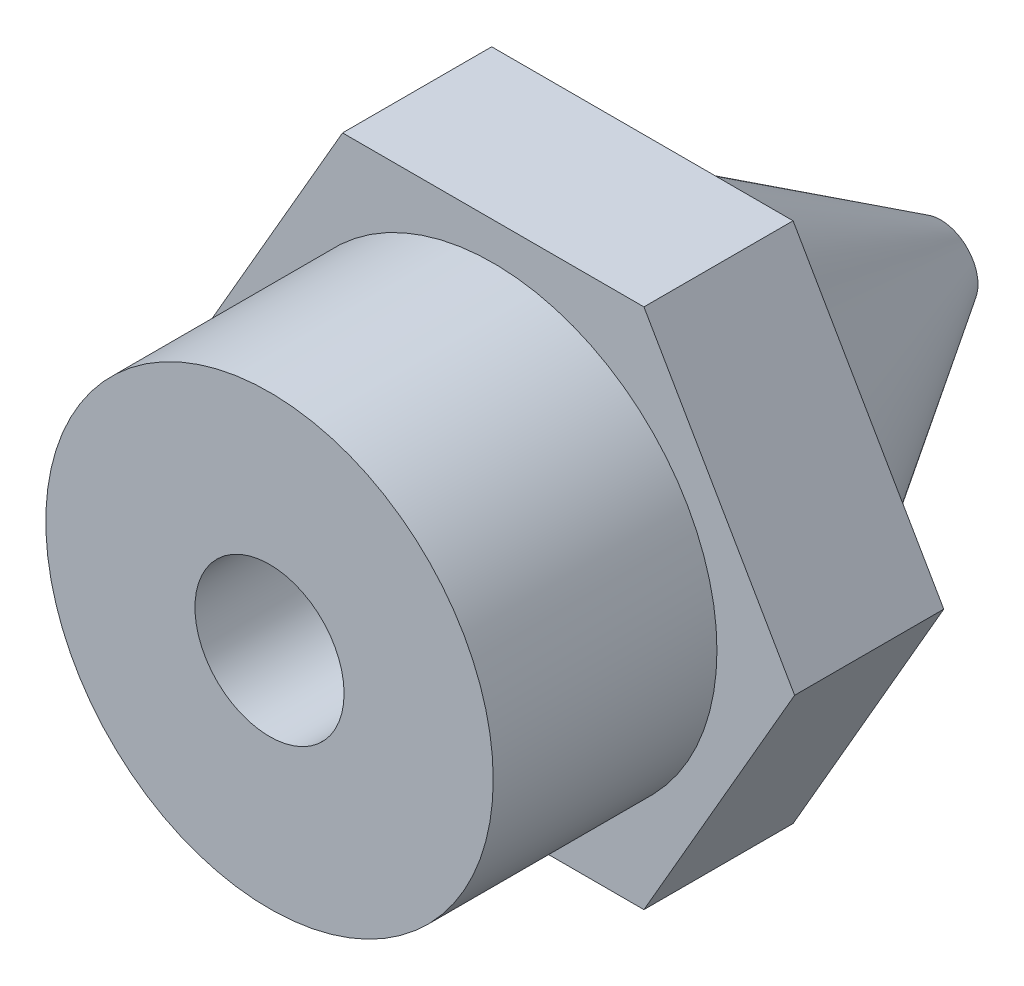
ISO-10303-21;
HEADER;
FILE_DESCRIPTION(('STEP AP214'),'2;1');
FILE_NAME('part.step','',(''),(''),'','','');
FILE_SCHEMA(('AUTOMOTIVE_DESIGN { 1 0 10303 214 1 1 1 1 }'));
ENDSEC;
DATA;
#1=APPLICATION_CONTEXT('core data for automotive mechanical design processes');
#2=APPLICATION_PROTOCOL_DEFINITION('international standard','automotive_design',2000,#1);
#3=PRODUCT_CONTEXT('',#1,'mechanical');
#4=PRODUCT('Part','Part','',(#3));
#5=PRODUCT_RELATED_PRODUCT_CATEGORY('part','',(#4));
#6=PRODUCT_DEFINITION_FORMATION('','',#4);
#7=PRODUCT_DEFINITION_CONTEXT('part definition',#1,'design');
#8=PRODUCT_DEFINITION('design','',#6,#7);
#9=PRODUCT_DEFINITION_SHAPE('','',#8);
#10=(LENGTH_UNIT() NAMED_UNIT(*) SI_UNIT(.MILLI.,.METRE.));
#11=(NAMED_UNIT(*) PLANE_ANGLE_UNIT() SI_UNIT($,.RADIAN.));
#12=(NAMED_UNIT(*) SI_UNIT($,.STERADIAN.) SOLID_ANGLE_UNIT());
#13=UNCERTAINTY_MEASURE_WITH_UNIT(LENGTH_MEASURE(1.E-05),#10,'distance_accuracy_value','');
#14=(GEOMETRIC_REPRESENTATION_CONTEXT(3) GLOBAL_UNCERTAINTY_ASSIGNED_CONTEXT((#13)) GLOBAL_UNIT_ASSIGNED_CONTEXT((#10,
#11,#12)) REPRESENTATION_CONTEXT('',''));
#15=CARTESIAN_POINT('',(0.,0.,0.));
#16=DIRECTION('',(0.,0.,1.));
#17=DIRECTION('',(1.,0.,0.));
#18=AXIS2_PLACEMENT_3D('',#15,#16,#17);
#19=CARTESIAN_POINT('',(2.02072594216368,3.50000000000001,9.));
#20=DIRECTION('',(0.,-1.,0.));
#21=DIRECTION('',(1.,0.,0.));
#22=AXIS2_PLACEMENT_3D('',#19,#20,#21);
#23=PLANE('',#22);
#24=DIRECTION('',(1.,0.,0.));
#25=VECTOR('',#24,1.);
#26=CARTESIAN_POINT('',(2.02072594216368,3.50000000000001,4.));
#27=LINE('',#26,#25);
#28=CARTESIAN_POINT('',(-2.02072594216371,3.49999999999999,4.));
#29=VERTEX_POINT('',#28);
#30=CARTESIAN_POINT('',(2.02072594216368,3.50000000000001,4.));
#31=VERTEX_POINT('',#30);
#32=EDGE_CURVE('E51',#29,#31,#27,.T.);
#33=ORIENTED_EDGE('',*,*,#32,.F.);
#34=DIRECTION('',(0.,0.,-1.));
#35=VECTOR('',#34,1.);
#36=CARTESIAN_POINT('',(-2.02072594216371,3.49999999999999,9.));
#37=LINE('',#36,#35);
#38=CARTESIAN_POINT('',(-2.02072594216371,3.49999999999999,6.));
#39=VERTEX_POINT('',#38);
#40=EDGE_CURVE('E119',#39,#29,#37,.T.);
#41=ORIENTED_EDGE('',*,*,#40,.F.);
#42=DIRECTION('',(-1.,0.,0.));
#43=VECTOR('',#42,1.);
#44=CARTESIAN_POINT('',(2.02072594216368,3.50000000000001,6.));
#45=LINE('',#44,#43);
#46=CARTESIAN_POINT('',(2.02072594216368,3.50000000000001,6.));
#47=VERTEX_POINT('',#46);
#48=EDGE_CURVE('E110',#47,#39,#45,.T.);
#49=ORIENTED_EDGE('',*,*,#48,.F.);
#50=DIRECTION('',(0.,0.,-1.));
#51=VECTOR('',#50,1.);
#52=CARTESIAN_POINT('',(2.02072594216368,3.50000000000001,9.));
#53=LINE('',#52,#51);
#54=EDGE_CURVE('E106',#47,#31,#53,.T.);
#55=ORIENTED_EDGE('',*,*,#54,.T.);
#56=EDGE_LOOP('',(#33,#41,#49,#55));
#57=FACE_BOUND('',#56,.T.);
#58=ADVANCED_FACE('F36',(#57),#23,.F.);
#59=CARTESIAN_POINT('',(-2.02072594216371,3.49999999999999,9.));
#60=DIRECTION('',(0.866025403784441,-0.499999999999995,0.));
#61=DIRECTION('',(0.499999999999995,0.866025403784442,0.));
#62=AXIS2_PLACEMENT_3D('',#59,#60,#61);
#63=PLANE('',#62);
#64=DIRECTION('',(0.499999999999995,0.866025403784442,0.));
#65=VECTOR('',#64,1.);
#66=CARTESIAN_POINT('',(-2.02072594216371,3.49999999999999,4.));
#67=LINE('',#66,#65);
#68=CARTESIAN_POINT('',(-4.04145188432738,0.,4.));
#69=VERTEX_POINT('',#68);
#70=EDGE_CURVE('E142',#69,#29,#67,.T.);
#71=ORIENTED_EDGE('',*,*,#70,.F.);
#72=DIRECTION('',(0.,0.,-1.));
#73=VECTOR('',#72,1.);
#74=CARTESIAN_POINT('',(-4.04145188432738,0.,9.));
#75=LINE('',#74,#73);
#76=CARTESIAN_POINT('',(-4.04145188432738,0.,6.));
#77=VERTEX_POINT('',#76);
#78=EDGE_CURVE('E116',#77,#69,#75,.T.);
#79=ORIENTED_EDGE('',*,*,#78,.F.);
#80=DIRECTION('',(-0.499999999999995,-0.866025403784442,0.));
#81=VECTOR('',#80,1.);
#82=CARTESIAN_POINT('',(-2.02072594216371,3.49999999999999,6.));
#83=LINE('',#82,#81);
#84=EDGE_CURVE('E127',#39,#77,#83,.T.);
#85=ORIENTED_EDGE('',*,*,#84,.F.);
#86=ORIENTED_EDGE('',*,*,#40,.T.);
#87=EDGE_LOOP('',(#71,#79,#85,#86));
#88=FACE_BOUND('',#87,.T.);
#89=ADVANCED_FACE('F179',(#88),#63,.F.);
#90=CARTESIAN_POINT('',(-4.04145188432738,0.,9.));
#91=DIRECTION('',(0.866025403784434,0.500000000000007,0.));
#92=DIRECTION('',(-0.500000000000007,0.866025403784435,0.));
#93=AXIS2_PLACEMENT_3D('',#90,#91,#92);
#94=PLANE('',#93);
#95=DIRECTION('',(-0.500000000000007,0.866025403784435,0.));
#96=VECTOR('',#95,1.);
#97=CARTESIAN_POINT('',(-4.04145188432738,0.,4.));
#98=LINE('',#97,#96);
#99=CARTESIAN_POINT('',(-2.02072594216366,-3.50000000000002,4.));
#100=VERTEX_POINT('',#99);
#101=EDGE_CURVE('E144',#100,#69,#98,.T.);
#102=ORIENTED_EDGE('',*,*,#101,.F.);
#103=DIRECTION('',(0.,0.,-1.));
#104=VECTOR('',#103,1.);
#105=CARTESIAN_POINT('',(-2.02072594216366,-3.50000000000002,9.));
#106=LINE('',#105,#104);
#107=CARTESIAN_POINT('',(-2.02072594216366,-3.50000000000002,6.));
#108=VERTEX_POINT('',#107);
#109=EDGE_CURVE('E108',#108,#100,#106,.T.);
#110=ORIENTED_EDGE('',*,*,#109,.F.);
#111=DIRECTION('',(0.500000000000007,-0.866025403784435,0.));
#112=VECTOR('',#111,1.);
#113=CARTESIAN_POINT('',(-4.04145188432738,0.,6.));
#114=LINE('',#113,#112);
#115=EDGE_CURVE('E128',#77,#108,#114,.T.);
#116=ORIENTED_EDGE('',*,*,#115,.F.);
#117=ORIENTED_EDGE('',*,*,#78,.T.);
#118=EDGE_LOOP('',(#102,#110,#116,#117));
#119=FACE_BOUND('',#118,.T.);
#120=ADVANCED_FACE('F183',(#119),#94,.F.);
#121=CARTESIAN_POINT('',(-2.02072594216366,-3.50000000000002,9.));
#122=DIRECTION('',(0.,1.,0.));
#123=DIRECTION('',(-1.,0.,0.));
#124=AXIS2_PLACEMENT_3D('',#121,#122,#123);
#125=PLANE('',#124);
#126=DIRECTION('',(-1.,0.,0.));
#127=VECTOR('',#126,1.);
#128=CARTESIAN_POINT('',(-2.02072594216366,-3.50000000000002,4.));
#129=LINE('',#128,#127);
#130=CARTESIAN_POINT('',(2.02072594216373,-3.49999999999998,4.));
#131=VERTEX_POINT('',#130);
#132=EDGE_CURVE('E102',#131,#100,#129,.T.);
#133=ORIENTED_EDGE('',*,*,#132,.F.);
#134=DIRECTION('',(0.,0.,-1.));
#135=VECTOR('',#134,1.);
#136=CARTESIAN_POINT('',(2.02072594216373,-3.49999999999998,9.));
#137=LINE('',#136,#135);
#138=CARTESIAN_POINT('',(2.02072594216373,-3.49999999999998,6.));
#139=VERTEX_POINT('',#138);
#140=EDGE_CURVE('E101',#139,#131,#137,.T.);
#141=ORIENTED_EDGE('',*,*,#140,.F.);
#142=DIRECTION('',(1.,0.,0.));
#143=VECTOR('',#142,1.);
#144=CARTESIAN_POINT('',(-2.02072594216366,-3.50000000000002,6.));
#145=LINE('',#144,#143);
#146=EDGE_CURVE('E132',#108,#139,#145,.T.);
#147=ORIENTED_EDGE('',*,*,#146,.F.);
#148=ORIENTED_EDGE('',*,*,#109,.T.);
#149=EDGE_LOOP('',(#133,#141,#147,#148));
#150=FACE_BOUND('',#149,.T.);
#151=ADVANCED_FACE('F189',(#150),#125,.F.);
#152=CARTESIAN_POINT('',(2.02072594216373,-3.49999999999998,9.));
#153=DIRECTION('',(-0.866025403784442,0.499999999999995,0.));
#154=DIRECTION('',(-0.499999999999995,-0.866025403784442,0.));
#155=AXIS2_PLACEMENT_3D('',#152,#153,#154);
#156=PLANE('',#155);
#157=DIRECTION('',(-0.499999999999995,-0.866025403784442,0.));
#158=VECTOR('',#157,1.);
#159=CARTESIAN_POINT('',(2.02072594216373,-3.49999999999998,4.));
#160=LINE('',#159,#158);
#161=CARTESIAN_POINT('',(4.04145188432738,0.,4.));
#162=VERTEX_POINT('',#161);
#163=EDGE_CURVE('E88',#162,#131,#160,.T.);
#164=ORIENTED_EDGE('',*,*,#163,.F.);
#165=DIRECTION('',(0.,0.,-1.));
#166=VECTOR('',#165,1.);
#167=CARTESIAN_POINT('',(4.04145188432738,0.,9.));
#168=LINE('',#167,#166);
#169=CARTESIAN_POINT('',(4.04145188432738,0.,6.));
#170=VERTEX_POINT('',#169);
#171=EDGE_CURVE('E99',#170,#162,#168,.T.);
#172=ORIENTED_EDGE('',*,*,#171,.F.);
#173=DIRECTION('',(0.499999999999995,0.866025403784442,0.));
#174=VECTOR('',#173,1.);
#175=CARTESIAN_POINT('',(2.02072594216373,-3.49999999999998,6.));
#176=LINE('',#175,#174);
#177=EDGE_CURVE('E59',#139,#170,#176,.T.);
#178=ORIENTED_EDGE('',*,*,#177,.F.);
#179=ORIENTED_EDGE('',*,*,#140,.T.);
#180=EDGE_LOOP('',(#164,#172,#178,#179));
#181=FACE_BOUND('',#180,.T.);
#182=ADVANCED_FACE('F98',(#181),#156,.F.);
#183=CARTESIAN_POINT('',(4.04145188432738,0.,9.));
#184=DIRECTION('',(-0.866025403784438,-0.500000000000001,0.));
#185=DIRECTION('',(0.500000000000001,-0.866025403784438,0.));
#186=AXIS2_PLACEMENT_3D('',#183,#184,#185);
#187=PLANE('',#186);
#188=DIRECTION('',(0.500000000000001,-0.866025403784438,0.));
#189=VECTOR('',#188,1.);
#190=CARTESIAN_POINT('',(4.04145188432738,0.,4.));
#191=LINE('',#190,#189);
#192=EDGE_CURVE('E44',#31,#162,#191,.T.);
#193=ORIENTED_EDGE('',*,*,#192,.F.);
#194=ORIENTED_EDGE('',*,*,#54,.F.);
#195=DIRECTION('',(-0.500000000000001,0.866025403784438,0.));
#196=VECTOR('',#195,1.);
#197=CARTESIAN_POINT('',(4.04145188432738,0.,6.));
#198=LINE('',#197,#196);
#199=EDGE_CURVE('E94',#170,#47,#198,.T.);
#200=ORIENTED_EDGE('',*,*,#199,.F.);
#201=ORIENTED_EDGE('',*,*,#171,.T.);
#202=EDGE_LOOP('',(#193,#194,#200,#201));
#203=FACE_BOUND('',#202,.T.);
#204=ADVANCED_FACE('F105',(#203),#187,.F.);
#205=CARTESIAN_POINT('',(0.,0.,6.));
#206=DIRECTION('',(0.,0.,1.));
#207=DIRECTION('',(1.,0.,0.));
#208=AXIS2_PLACEMENT_3D('',#205,#206,#207);
#209=PLANE('',#208);
#210=CARTESIAN_POINT('',(0.,0.,6.));
#211=DIRECTION('',(0.,0.,1.));
#212=DIRECTION('',(1.,0.,0.));
#213=AXIS2_PLACEMENT_3D('',#210,#211,#212);
#214=CIRCLE('',#213,3.);
#215=CARTESIAN_POINT('',(3.,0.,6.));
#216=VERTEX_POINT('',#215);
#217=EDGE_CURVE('E135',#216,#216,#214,.T.);
#218=ORIENTED_EDGE('',*,*,#217,.F.);
#219=EDGE_LOOP('',(#218));
#220=FACE_BOUND('',#219,.T.);
#221=ORIENTED_EDGE('',*,*,#48,.T.);
#222=ORIENTED_EDGE('',*,*,#84,.T.);
#223=ORIENTED_EDGE('',*,*,#115,.T.);
#224=ORIENTED_EDGE('',*,*,#146,.T.);
#225=ORIENTED_EDGE('',*,*,#177,.T.);
#226=ORIENTED_EDGE('',*,*,#199,.T.);
#227=EDGE_LOOP('',(#221,#222,#223,#224,#225,#226));
#228=FACE_BOUND('',#227,.T.);
#229=ADVANCED_FACE('F123',(#220,#228),#209,.T.);
#230=CARTESIAN_POINT('',(0.,0.,6.));
#231=DIRECTION('',(0.,0.,1.));
#232=DIRECTION('',(1.,0.,0.));
#233=AXIS2_PLACEMENT_3D('',#230,#231,#232);
#234=CYLINDRICAL_SURFACE('',#233,3.);
#235=ORIENTED_EDGE('',*,*,#217,.T.);
#236=EDGE_LOOP('',(#235));
#237=FACE_BOUND('',#236,.T.);
#238=CARTESIAN_POINT('',(0.,0.,9.));
#239=DIRECTION('',(0.,0.,1.));
#240=DIRECTION('',(1.,0.,0.));
#241=AXIS2_PLACEMENT_3D('',#238,#239,#240);
#242=CIRCLE('',#241,3.);
#243=CARTESIAN_POINT('',(3.,0.,9.));
#244=VERTEX_POINT('',#243);
#245=EDGE_CURVE('E136',#244,#244,#242,.T.);
#246=ORIENTED_EDGE('',*,*,#245,.F.);
#247=EDGE_LOOP('',(#246));
#248=FACE_BOUND('',#247,.T.);
#249=ADVANCED_FACE('F164',(#237,#248),#234,.T.);
#250=CARTESIAN_POINT('',(0.,0.,9.));
#251=DIRECTION('',(0.,0.,1.));
#252=DIRECTION('',(1.,0.,0.));
#253=AXIS2_PLACEMENT_3D('',#250,#251,#252);
#254=PLANE('',#253);
#255=CARTESIAN_POINT('',(0.,0.,9.));
#256=DIRECTION('',(0.,0.,1.));
#257=DIRECTION('',(1.,0.,0.));
#258=AXIS2_PLACEMENT_3D('',#255,#256,#257);
#259=CIRCLE('',#258,1.);
#260=CARTESIAN_POINT('',(1.,0.,9.));
#261=VERTEX_POINT('',#260);
#262=EDGE_CURVE('E155',#261,#261,#259,.T.);
#263=ORIENTED_EDGE('',*,*,#262,.F.);
#264=EDGE_LOOP('',(#263));
#265=FACE_BOUND('',#264,.T.);
#266=ORIENTED_EDGE('',*,*,#245,.T.);
#267=EDGE_LOOP('',(#266));
#268=FACE_BOUND('',#267,.T.);
#269=ADVANCED_FACE('F161',(#265,#268),#254,.T.);
#270=CARTESIAN_POINT('',(0.,0.,4.));
#271=DIRECTION('',(0.,0.,-1.));
#272=DIRECTION('',(-1.,0.,0.));
#273=AXIS2_PLACEMENT_3D('',#270,#271,#272);
#274=PLANE('',#273);
#275=CARTESIAN_POINT('',(0.,0.,4.));
#276=DIRECTION('',(0.,0.,-1.));
#277=DIRECTION('',(-1.,0.,0.));
#278=AXIS2_PLACEMENT_3D('',#275,#276,#277);
#279=CIRCLE('',#278,3.);
#280=CARTESIAN_POINT('',(2.99999999999998,0.,4.));
#281=VERTEX_POINT('',#280);
#282=EDGE_CURVE('E103',#281,#281,#279,.T.);
#283=ORIENTED_EDGE('',*,*,#282,.F.);
#284=EDGE_LOOP('',(#283));
#285=FACE_BOUND('',#284,.T.);
#286=ORIENTED_EDGE('',*,*,#32,.T.);
#287=ORIENTED_EDGE('',*,*,#192,.T.);
#288=ORIENTED_EDGE('',*,*,#163,.T.);
#289=ORIENTED_EDGE('',*,*,#132,.T.);
#290=ORIENTED_EDGE('',*,*,#101,.T.);
#291=ORIENTED_EDGE('',*,*,#70,.T.);
#292=EDGE_LOOP('',(#286,#287,#288,#289,#290,#291));
#293=FACE_BOUND('',#292,.T.);
#294=ADVANCED_FACE('F87',(#285,#293),#274,.T.);
#295=CARTESIAN_POINT('',(0.,0.,0.));
#296=DIRECTION('',(0.,0.,1.));
#297=DIRECTION('',(1.,0.,0.));
#298=AXIS2_PLACEMENT_3D('',#295,#296,#297);
#299=PLANE('',#298);
#300=CARTESIAN_POINT('',(0.,0.,0.));
#301=DIRECTION('',(0.,0.,1.));
#302=DIRECTION('',(1.,0.,0.));
#303=AXIS2_PLACEMENT_3D('',#300,#301,#302);
#304=CIRCLE('',#303,0.300000000000001);
#305=CARTESIAN_POINT('',(0.3,0.,0.));
#306=VERTEX_POINT('',#305);
#307=EDGE_CURVE('E149',#306,#306,#304,.T.);
#308=ORIENTED_EDGE('',*,*,#307,.T.);
#309=EDGE_LOOP('',(#308));
#310=FACE_BOUND('',#309,.T.);
#311=CARTESIAN_POINT('',(0.,0.,0.));
#312=DIRECTION('',(0.,0.,1.));
#313=DIRECTION('',(1.,0.,0.));
#314=AXIS2_PLACEMENT_3D('',#311,#312,#313);
#315=CIRCLE('',#314,0.500522592362688);
#316=CARTESIAN_POINT('',(0.500522592362688,0.,0.));
#317=VERTEX_POINT('',#316);
#318=EDGE_CURVE('E11',#317,#317,#315,.F.);
#319=ORIENTED_EDGE('',*,*,#318,.T.);
#320=EDGE_LOOP('',(#319));
#321=FACE_BOUND('',#320,.T.);
#322=ADVANCED_FACE('F198',(#310,#321),#299,.F.);
#323=CARTESIAN_POINT('',(0.,0.,0.));
#324=DIRECTION('',(0.,0.,1.));
#325=DIRECTION('',(1.,0.,0.));
#326=AXIS2_PLACEMENT_3D('',#323,#324,#325);
#327=CONICAL_SURFACE('',#326,0.500522592362688,0.558505360638183);
#328=CARTESIAN_POINT('',(2.99999999999998,0.,4.));
#329=CARTESIAN_POINT('',(2.97396377700376,0.,3.95833333333333));
#330=CARTESIAN_POINT('',(2.94792755400754,0.,3.91666666666667));
#331=CARTESIAN_POINT('',(2.8958551080151,0.,3.83333333333333));
#332=CARTESIAN_POINT('',(2.86981888501887,0.,3.79166666666667));
#333=CARTESIAN_POINT('',(2.81774643902643,0.,3.70833333333333));
#334=CARTESIAN_POINT('',(2.79171021603021,0.,3.66666666666667));
#335=CARTESIAN_POINT('',(2.73963777003777,0.,3.58333333333333));
#336=CARTESIAN_POINT('',(2.71360154704154,0.,3.54166666666667));
#337=CARTESIAN_POINT('',(2.6615291010491,0.,3.45833333333333));
#338=CARTESIAN_POINT('',(2.63549287805288,0.,3.41666666666667));
#339=CARTESIAN_POINT('',(2.58342043206043,0.,3.33333333333333));
#340=CARTESIAN_POINT('',(2.55738420906421,0.,3.29166666666667));
#341=CARTESIAN_POINT('',(2.50531176307177,0.,3.20833333333333));
#342=CARTESIAN_POINT('',(2.47927554007555,0.,3.16666666666667));
#343=CARTESIAN_POINT('',(2.4272030940831,0.,3.08333333333333));
#344=CARTESIAN_POINT('',(2.40116687108688,0.,3.04166666666667));
#345=CARTESIAN_POINT('',(2.34909442509444,0.,2.95833333333333));
#346=CARTESIAN_POINT('',(2.32305820209822,0.,2.91666666666667));
#347=CARTESIAN_POINT('',(2.27098575610577,0.,2.83333333333333));
#348=CARTESIAN_POINT('',(2.24494953310955,0.,2.79166666666667));
#349=CARTESIAN_POINT('',(2.19287708711711,0.,2.70833333333333));
#350=CARTESIAN_POINT('',(2.16684086412088,0.,2.66666666666667));
#351=CARTESIAN_POINT('',(2.11476841812844,0.,2.58333333333333));
#352=CARTESIAN_POINT('',(2.08873219513222,0.,2.54166666666667));
#353=CARTESIAN_POINT('',(2.03665974913978,0.,2.45833333333333));
#354=CARTESIAN_POINT('',(2.01062352614355,0.,2.41666666666667));
#355=CARTESIAN_POINT('',(1.95855108015111,0.,2.33333333333333));
#356=CARTESIAN_POINT('',(1.93251485715489,0.,2.29166666666667));
#357=CARTESIAN_POINT('',(1.88044241116245,0.,2.20833333333333));
#358=CARTESIAN_POINT('',(1.85440618816622,0.,2.16666666666667));
#359=CARTESIAN_POINT('',(1.80233374217378,0.,2.08333333333333));
#360=CARTESIAN_POINT('',(1.77629751917756,0.,2.04166666666667));
#361=CARTESIAN_POINT('',(1.72422507318511,0.,1.95833333333333));
#362=CARTESIAN_POINT('',(1.69818885018889,0.,1.91666666666667));
#363=CARTESIAN_POINT('',(1.64611640419645,0.,1.83333333333333));
#364=CARTESIAN_POINT('',(1.62008018120023,0.,1.79166666666667));
#365=CARTESIAN_POINT('',(1.56800773520778,0.,1.70833333333333));
#366=CARTESIAN_POINT('',(1.54197151221156,0.,1.66666666666667));
#367=CARTESIAN_POINT('',(1.48989906621912,0.,1.58333333333333));
#368=CARTESIAN_POINT('',(1.4638628432229,0.,1.54166666666667));
#369=CARTESIAN_POINT('',(1.41179039723045,0.,1.45833333333333));
#370=CARTESIAN_POINT('',(1.38575417423423,0.,1.41666666666667));
#371=CARTESIAN_POINT('',(1.33368172824179,0.,1.33333333333333));
#372=CARTESIAN_POINT('',(1.30764550524556,0.,1.29166666666667));
#373=CARTESIAN_POINT('',(1.25557305925312,0.,1.20833333333333));
#374=CARTESIAN_POINT('',(1.2295368362569,0.,1.16666666666667));
#375=CARTESIAN_POINT('',(1.17746439026446,0.,1.08333333333333));
#376=CARTESIAN_POINT('',(1.15142816726823,0.,1.04166666666667));
#377=CARTESIAN_POINT('',(1.09935572127579,0.,0.958333333333333));
#378=CARTESIAN_POINT('',(1.07331949827957,0.,0.916666666666667));
#379=CARTESIAN_POINT('',(1.02124705228712,0.,0.833333333333333));
#380=CARTESIAN_POINT('',(0.995210829290903,0.,0.791666666666667));
#381=CARTESIAN_POINT('',(0.943138383298459,0.,0.708333333333333));
#382=CARTESIAN_POINT('',(0.917102160302237,0.,0.666666666666667));
#383=CARTESIAN_POINT('',(0.865029714309794,0.,0.583333333333333));
#384=CARTESIAN_POINT('',(0.838993491313572,0.,0.541666666666667));
#385=CARTESIAN_POINT('',(0.786921045321128,0.,0.458333333333333));
#386=CARTESIAN_POINT('',(0.760884822324907,0.,0.416666666666667));
#387=CARTESIAN_POINT('',(0.708812376332463,0.,0.333333333333333));
#388=CARTESIAN_POINT('',(0.682776153336241,0.,0.291666666666667));
#389=CARTESIAN_POINT('',(0.630703707343798,0.,0.208333333333333));
#390=CARTESIAN_POINT('',(0.604667484347576,0.,0.166666666666667));
#391=CARTESIAN_POINT('',(0.552595038355132,0.,0.0833333333333335));
#392=CARTESIAN_POINT('',(0.52655881535891,0.,0.0416666666666668));
#393=CARTESIAN_POINT('',(0.500522592362688,0.,0.));
#394=B_SPLINE_CURVE_WITH_KNOTS('',3,(#328,#329,#330,#331,#332,#333,#334,#335,#336,#337,#338,
#339,#340,#341,#342,#343,#344,#345,#346,#347,#348,#349,#350,#351,#352,#353,#354,#355,#356,#357,
#358,#359,#360,#361,#362,#363,#364,#365,#366,#367,#368,#369,#370,#371,#372,#373,#374,#375,#376,
#377,#378,#379,#380,#381,#382,#383,#384,#385,#386,#387,#388,#389,#390,#391,#392,#393),
.UNSPECIFIED.,.F.,.F.,(4,2,2,2,2,2,2,2,2,2,2,2,2,2,2,2,2,2,2,2,2,2,2,2,2,2,2,2,2,2,2,2,4),(0.,
0.147397300420262,0.294794600840524,0.442191901260785,0.589589201681047,0.736986502101309,
0.884383802521571,1.03178110294183,1.17917840336209,1.32657570378236,1.47397300420262,
1.62137030462288,1.76876760504314,1.9161649054634,2.06356220588366,2.21095950630393,
2.35835680672419,2.50575410714445,2.65315140756471,2.80054870798497,2.94794600840524,
3.0953433088255,3.24274060924576,3.39013790966602,3.53753521008628,3.68493251050655,
3.83232981092681,3.97972711134707,4.12712441176733,4.27452171218759,4.42191901260786,
4.56931631302812,4.71671361344838),.UNSPECIFIED.);
#395=EDGE_CURVE('BSEAM38',#281,#317,#394,.T.);
#396=ORIENTED_EDGE('',*,*,#282,.T.);
#397=ORIENTED_EDGE('',*,*,#318,.F.);
#398=ORIENTED_EDGE('',*,*,#395,.T.);
#399=ORIENTED_EDGE('',*,*,#395,.F.);
#400=EDGE_LOOP('',(#396,#398,#397,#399));
#401=FACE_BOUND('',#400,.T.);
#402=ADVANCED_FACE('F38',(#401),#327,.T.);
#403=CARTESIAN_POINT('',(0.,0.,5.70104249958253));
#404=DIRECTION('',(0.,0.,1.));
#405=DIRECTION('',(1.,0.,0.));
#406=AXIS2_PLACEMENT_3D('',#403,#404,#405);
#407=CONICAL_SURFACE('',#406,1.,0.122173047639596);
#408=CARTESIAN_POINT('',(0.,0.,5.70104249958253));
#409=DIRECTION('',(0.,0.,1.));
#410=DIRECTION('',(1.,0.,0.));
#411=AXIS2_PLACEMENT_3D('',#408,#409,#410);
#412=CIRCLE('',#411,1.);
#413=CARTESIAN_POINT('',(1.,0.,5.70104249958253));
#414=VERTEX_POINT('',#413);
#415=EDGE_CURVE('E152',#414,#414,#412,.T.);
#416=CARTESIAN_POINT('',(0.3,0.,0.));
#417=CARTESIAN_POINT('',(0.307291666666667,0.,0.0593858593706504));
#418=CARTESIAN_POINT('',(0.314583333333333,0.,0.118771718741302));
#419=CARTESIAN_POINT('',(0.329166666666667,0.,0.237543437482605));
#420=CARTESIAN_POINT('',(0.336458333333333,0.,0.296929296853256));
#421=CARTESIAN_POINT('',(0.351041666666667,0.,0.415701015594559));
#422=CARTESIAN_POINT('',(0.358333333333333,0.,0.47508687496521));
#423=CARTESIAN_POINT('',(0.372916666666667,0.,0.593858593706513));
#424=CARTESIAN_POINT('',(0.380208333333333,0.,0.653244453077164));
#425=CARTESIAN_POINT('',(0.394791666666667,0.,0.772016171818467));
#426=CARTESIAN_POINT('',(0.402083333333333,0.,0.831402031189118));
#427=CARTESIAN_POINT('',(0.416666666666667,0.,0.950173749930421));
#428=CARTESIAN_POINT('',(0.423958333333333,0.,1.00955960930107));
#429=CARTESIAN_POINT('',(0.438541666666667,0.,1.12833132804238));
#430=CARTESIAN_POINT('',(0.445833333333333,0.,1.18771718741303));
#431=CARTESIAN_POINT('',(0.460416666666667,0.,1.30648890615433));
#432=CARTESIAN_POINT('',(0.467708333333333,0.,1.36587476552498));
#433=CARTESIAN_POINT('',(0.482291666666667,0.,1.48464648426628));
#434=CARTESIAN_POINT('',(0.489583333333333,0.,1.54403234363693));
#435=CARTESIAN_POINT('',(0.504166666666667,0.,1.66280406237824));
#436=CARTESIAN_POINT('',(0.511458333333333,0.,1.72218992174889));
#437=CARTESIAN_POINT('',(0.526041666666667,0.,1.84096164049019));
#438=CARTESIAN_POINT('',(0.533333333333333,0.,1.90034749986084));
#439=CARTESIAN_POINT('',(0.547916666666667,0.,2.01911921860215));
#440=CARTESIAN_POINT('',(0.555208333333333,0.,2.0785050779728));
#441=CARTESIAN_POINT('',(0.569791666666667,0.,2.1972767967141));
#442=CARTESIAN_POINT('',(0.577083333333334,0.,2.25666265608475));
#443=CARTESIAN_POINT('',(0.591666666666667,0.,2.37543437482605));
#444=CARTESIAN_POINT('',(0.598958333333334,0.,2.43482023419671));
#445=CARTESIAN_POINT('',(0.613541666666667,0.,2.55359195293801));
#446=CARTESIAN_POINT('',(0.620833333333334,0.,2.61297781230866));
#447=CARTESIAN_POINT('',(0.635416666666667,0.,2.73174953104996));
#448=CARTESIAN_POINT('',(0.642708333333334,0.,2.79113539042061));
#449=CARTESIAN_POINT('',(0.657291666666667,0.,2.90990710916192));
#450=CARTESIAN_POINT('',(0.664583333333334,0.,2.96929296853257));
#451=CARTESIAN_POINT('',(0.679166666666667,0.,3.08806468727387));
#452=CARTESIAN_POINT('',(0.686458333333334,0.,3.14745054664452));
#453=CARTESIAN_POINT('',(0.701041666666667,0.,3.26622226538583));
#454=CARTESIAN_POINT('',(0.708333333333334,0.,3.32560812475648));
#455=CARTESIAN_POINT('',(0.722916666666667,0.,3.44437984349778));
#456=CARTESIAN_POINT('',(0.730208333333334,0.,3.50376570286843));
#457=CARTESIAN_POINT('',(0.744791666666667,0.,3.62253742160973));
#458=CARTESIAN_POINT('',(0.752083333333334,0.,3.68192328098039));
#459=CARTESIAN_POINT('',(0.766666666666667,0.,3.80069499972169));
#460=CARTESIAN_POINT('',(0.773958333333334,0.,3.86008085909234));
#461=CARTESIAN_POINT('',(0.788541666666667,0.,3.97885257783364));
#462=CARTESIAN_POINT('',(0.795833333333334,0.,4.03823843720429));
#463=CARTESIAN_POINT('',(0.810416666666667,0.,4.1570101559456));
#464=CARTESIAN_POINT('',(0.817708333333334,0.,4.21639601531625));
#465=CARTESIAN_POINT('',(0.832291666666667,0.,4.33516773405755));
#466=CARTESIAN_POINT('',(0.839583333333334,0.,4.3945535934282));
#467=CARTESIAN_POINT('',(0.854166666666667,0.,4.51332531216951));
#468=CARTESIAN_POINT('',(0.861458333333334,0.,4.57271117154016));
#469=CARTESIAN_POINT('',(0.876041666666667,0.,4.69148289028146));
#470=CARTESIAN_POINT('',(0.883333333333334,0.,4.75086874965211));
#471=CARTESIAN_POINT('',(0.897916666666667,0.,4.86964046839341));
#472=CARTESIAN_POINT('',(0.905208333333334,0.,4.92902632776406));
#473=CARTESIAN_POINT('',(0.919791666666667,0.,5.04779804650537));
#474=CARTESIAN_POINT('',(0.927083333333334,0.,5.10718390587602));
#475=CARTESIAN_POINT('',(0.941666666666667,0.,5.22595562461732));
#476=CARTESIAN_POINT('',(0.948958333333334,0.,5.28534148398797));
#477=CARTESIAN_POINT('',(0.963541666666667,0.,5.40411320272928));
#478=CARTESIAN_POINT('',(0.970833333333334,0.,5.46349906209993));
#479=CARTESIAN_POINT('',(0.985416666666667,0.,5.58227078084123));
#480=CARTESIAN_POINT('',(0.992708333333334,0.,5.64165664021188));
#481=CARTESIAN_POINT('',(1.,0.,5.70104249958253));
#482=B_SPLINE_CURVE_WITH_KNOTS('',3,(#416,#417,#418,#419,#420,#421,#422,#423,#424,#425,#426,
#427,#428,#429,#430,#431,#432,#433,#434,#435,#436,#437,#438,#439,#440,#441,#442,#443,#444,#445,
#446,#447,#448,#449,#450,#451,#452,#453,#454,#455,#456,#457,#458,#459,#460,#461,#462,#463,#464,
#465,#466,#467,#468,#469,#470,#471,#472,#473,#474,#475,#476,#477,#478,#479,#480,#481),
.UNSPECIFIED.,.F.,.F.,(4,2,2,2,2,2,2,2,2,2,2,2,2,2,2,2,2,2,2,2,2,2,2,2,2,2,2,2,2,2,2,2,4),(0.,
0.179495510427746,0.358991020855492,0.538486531283238,0.717982041710983,0.897477552138729,
1.07697306256648,1.25646857299422,1.43596408342197,1.61545959384971,1.79495510427746,
1.97445061470521,2.15394612513295,2.3334416355607,2.51293714598844,2.69243265641619,
2.87192816684394,3.05142367727168,3.23091918769943,3.41041469812717,3.58991020855492,
3.76940571898267,3.94890122941041,4.12839673983816,4.3078922502659,4.48738776069365,
4.6668832711214,4.84637878154914,5.02587429197689,5.20536980240464,5.38486531283238,
5.56436082326013,5.74385633368787),.UNSPECIFIED.);
#483=EDGE_CURVE('BSEAM205',#306,#414,#482,.T.);
#484=ORIENTED_EDGE('',*,*,#307,.F.);
#485=ORIENTED_EDGE('',*,*,#415,.T.);
#486=ORIENTED_EDGE('',*,*,#483,.T.);
#487=ORIENTED_EDGE('',*,*,#483,.F.);
#488=EDGE_LOOP('',(#484,#486,#485,#487));
#489=FACE_BOUND('',#488,.T.);
#490=ADVANCED_FACE('F205',(#489),#407,.F.);
#491=CARTESIAN_POINT('',(0.,0.,10.3816051571313));
#492=DIRECTION('',(0.,0.,1.));
#493=DIRECTION('',(1.,0.,0.));
#494=AXIS2_PLACEMENT_3D('',#491,#492,#493);
#495=CYLINDRICAL_SURFACE('',#494,1.);
#496=ORIENTED_EDGE('',*,*,#415,.F.);
#497=EDGE_LOOP('',(#496));
#498=FACE_BOUND('',#497,.T.);
#499=ORIENTED_EDGE('',*,*,#262,.T.);
#500=EDGE_LOOP('',(#499));
#501=FACE_BOUND('',#500,.T.);
#502=ADVANCED_FACE('F159',(#498,#501),#495,.F.);
#503=CLOSED_SHELL('',(#58,#89,#120,#151,#182,#204,#229,#249,#269,#294,#322,#402,#490,#502));
#504=MANIFOLD_SOLID_BREP('B2',#503);
#505=ADVANCED_BREP_SHAPE_REPRESENTATION('',(#18,#504),#14);
#506=SHAPE_DEFINITION_REPRESENTATION(#9,#505);
ENDSEC;
END-ISO-10303-21;
